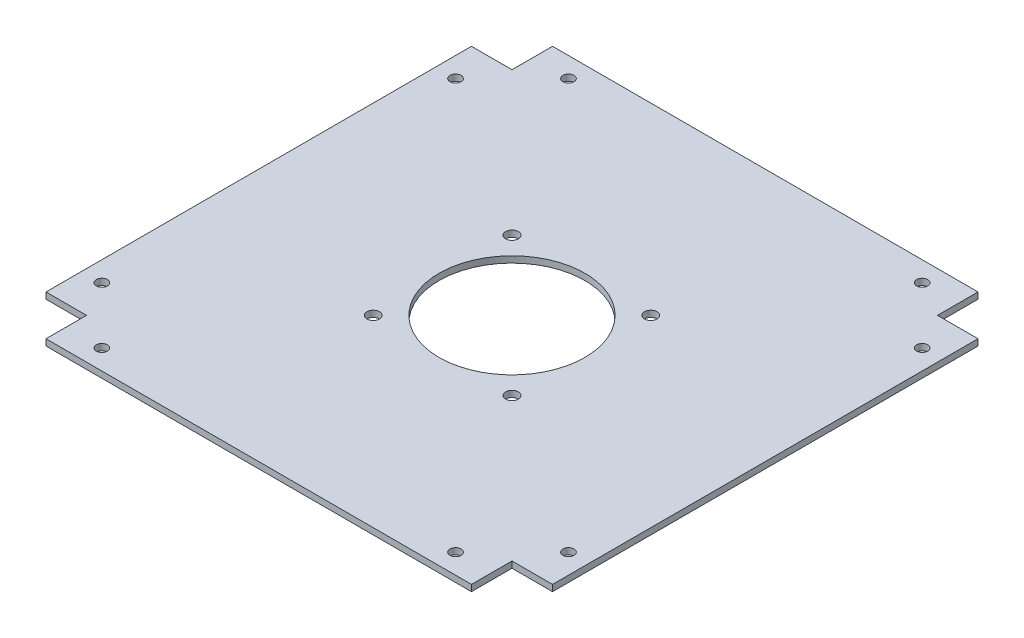
ISO-10303-21;
HEADER;
FILE_DESCRIPTION(('STEP AP214'),'2;1');
FILE_NAME('part.step','',(''),(''),'','','');
FILE_SCHEMA(('AUTOMOTIVE_DESIGN { 1 0 10303 214 1 1 1 1 }'));
ENDSEC;
DATA;
#1=APPLICATION_CONTEXT('core data for automotive mechanical design processes');
#2=APPLICATION_PROTOCOL_DEFINITION('international standard','automotive_design',2000,#1);
#3=PRODUCT_CONTEXT('',#1,'mechanical');
#4=PRODUCT('Part','Part','',(#3));
#5=PRODUCT_RELATED_PRODUCT_CATEGORY('part','',(#4));
#6=PRODUCT_DEFINITION_FORMATION('','',#4);
#7=PRODUCT_DEFINITION_CONTEXT('part definition',#1,'design');
#8=PRODUCT_DEFINITION('design','',#6,#7);
#9=PRODUCT_DEFINITION_SHAPE('','',#8);
#10=(LENGTH_UNIT() NAMED_UNIT(*) SI_UNIT(.MILLI.,.METRE.));
#11=(NAMED_UNIT(*) PLANE_ANGLE_UNIT() SI_UNIT($,.RADIAN.));
#12=(NAMED_UNIT(*) SI_UNIT($,.STERADIAN.) SOLID_ANGLE_UNIT());
#13=UNCERTAINTY_MEASURE_WITH_UNIT(LENGTH_MEASURE(1.E-05),#10,'distance_accuracy_value','');
#14=(GEOMETRIC_REPRESENTATION_CONTEXT(3) GLOBAL_UNCERTAINTY_ASSIGNED_CONTEXT((#13)) GLOBAL_UNIT_ASSIGNED_CONTEXT((#10,
#11,#12)) REPRESENTATION_CONTEXT('',''));
#15=CARTESIAN_POINT('',(0.,0.,0.));
#16=DIRECTION('',(0.,0.,1.));
#17=DIRECTION('',(1.,0.,0.));
#18=AXIS2_PLACEMENT_3D('',#15,#16,#17);
#19=CARTESIAN_POINT('',(0.,-1.5875,0.));
#20=DIRECTION('',(0.,-1.,0.));
#21=DIRECTION('',(0.,0.,-1.));
#22=AXIS2_PLACEMENT_3D('',#19,#20,#21);
#23=PLANE('',#22);
#24=DIRECTION('',(-1.,0.,0.));
#25=VECTOR('',#24,1.);
#26=CARTESIAN_POINT('',(-127.,-1.5875,127.));
#27=LINE('',#26,#25);
#28=CARTESIAN_POINT('',(106.679999999999,-1.5875,127.000000000001));
#29=VERTEX_POINT('',#28);
#30=CARTESIAN_POINT('',(-106.68,-1.5875,127.));
#31=VERTEX_POINT('',#30);
#32=EDGE_CURVE('E685',#29,#31,#27,.T.);
#33=ORIENTED_EDGE('',*,*,#32,.T.);
#34=DIRECTION('',(0.,0.,-1.));
#35=VECTOR('',#34,1.);
#36=CARTESIAN_POINT('',(-106.68,-1.5875,106.68));
#37=LINE('',#36,#35);
#38=CARTESIAN_POINT('',(-106.68,-1.5875,106.68));
#39=VERTEX_POINT('',#38);
#40=EDGE_CURVE('E698',#31,#39,#37,.T.);
#41=ORIENTED_EDGE('',*,*,#40,.T.);
#42=DIRECTION('',(-1.,0.,0.));
#43=VECTOR('',#42,1.);
#44=CARTESIAN_POINT('',(-127.,-1.5875,106.68));
#45=LINE('',#44,#43);
#46=CARTESIAN_POINT('',(-127.,-1.5875,106.68));
#47=VERTEX_POINT('',#46);
#48=EDGE_CURVE('E704',#39,#47,#45,.T.);
#49=ORIENTED_EDGE('',*,*,#48,.T.);
#50=DIRECTION('',(0.,0.,-1.));
#51=VECTOR('',#50,1.);
#52=CARTESIAN_POINT('',(-127.,-1.5875,127.));
#53=LINE('',#52,#51);
#54=CARTESIAN_POINT('',(-127.,-1.5875,-106.68));
#55=VERTEX_POINT('',#54);
#56=EDGE_CURVE('E134',#47,#55,#53,.T.);
#57=ORIENTED_EDGE('',*,*,#56,.T.);
#58=DIRECTION('',(1.,0.,0.));
#59=VECTOR('',#58,1.);
#60=CARTESIAN_POINT('',(-127.,-1.5875,-106.68));
#61=LINE('',#60,#59);
#62=CARTESIAN_POINT('',(-106.68,-1.5875,-106.68));
#63=VERTEX_POINT('',#62);
#64=EDGE_CURVE('E132',#55,#63,#61,.T.);
#65=ORIENTED_EDGE('',*,*,#64,.T.);
#66=DIRECTION('',(0.,0.,-1.));
#67=VECTOR('',#66,1.);
#68=CARTESIAN_POINT('',(-106.68,-1.5875,-106.68));
#69=LINE('',#68,#67);
#70=CARTESIAN_POINT('',(-106.68,-1.5875,-127.));
#71=VERTEX_POINT('',#70);
#72=EDGE_CURVE('E128',#63,#71,#69,.T.);
#73=ORIENTED_EDGE('',*,*,#72,.T.);
#74=DIRECTION('',(1.,0.,0.));
#75=VECTOR('',#74,1.);
#76=CARTESIAN_POINT('',(-127.,-1.5875,-127.));
#77=LINE('',#76,#75);
#78=CARTESIAN_POINT('',(106.679999999999,-1.5875,-127.));
#79=VERTEX_POINT('',#78);
#80=EDGE_CURVE('E617',#71,#79,#77,.T.);
#81=ORIENTED_EDGE('',*,*,#80,.T.);
#82=DIRECTION('',(0.,0.,1.));
#83=VECTOR('',#82,1.);
#84=CARTESIAN_POINT('',(106.679999999999,-1.5875,-106.680000000001));
#85=LINE('',#84,#83);
#86=CARTESIAN_POINT('',(106.679999999999,-1.5875,-106.680000000001));
#87=VERTEX_POINT('',#86);
#88=EDGE_CURVE('E624',#79,#87,#85,.T.);
#89=ORIENTED_EDGE('',*,*,#88,.T.);
#90=DIRECTION('',(1.,0.,0.));
#91=VECTOR('',#90,1.);
#92=CARTESIAN_POINT('',(126.999999999999,-1.5875,-106.680000000001));
#93=LINE('',#92,#91);
#94=CARTESIAN_POINT('',(126.999999999999,-1.5875,-106.680000000001));
#95=VERTEX_POINT('',#94);
#96=EDGE_CURVE('E642',#87,#95,#93,.T.);
#97=ORIENTED_EDGE('',*,*,#96,.T.);
#98=DIRECTION('',(0.,0.,1.));
#99=VECTOR('',#98,1.);
#100=CARTESIAN_POINT('',(127.,-1.5875,127.));
#101=LINE('',#100,#99);
#102=CARTESIAN_POINT('',(127.,-1.5875,106.680000000001));
#103=VERTEX_POINT('',#102);
#104=EDGE_CURVE('E646',#95,#103,#101,.T.);
#105=ORIENTED_EDGE('',*,*,#104,.T.);
#106=DIRECTION('',(-1.,0.,0.));
#107=VECTOR('',#106,1.);
#108=CARTESIAN_POINT('',(126.999999999999,-1.5875,106.680000000001));
#109=LINE('',#108,#107);
#110=CARTESIAN_POINT('',(106.679999999999,-1.5875,106.680000000001));
#111=VERTEX_POINT('',#110);
#112=EDGE_CURVE('E669',#103,#111,#109,.T.);
#113=ORIENTED_EDGE('',*,*,#112,.T.);
#114=DIRECTION('',(0.,0.,1.));
#115=VECTOR('',#114,1.);
#116=CARTESIAN_POINT('',(106.679999999999,-1.5875,106.680000000001));
#117=LINE('',#116,#115);
#118=EDGE_CURVE('E675',#111,#29,#117,.T.);
#119=ORIENTED_EDGE('',*,*,#118,.T.);
#120=EDGE_LOOP('',(#33,#41,#49,#57,#65,#73,#81,#89,#97,#105,#113,#119));
#121=FACE_BOUND('',#120,.T.);
#122=CARTESIAN_POINT('',(0.,-1.5875,0.));
#123=DIRECTION('',(0.,1.,0.));
#124=DIRECTION('',(0.,0.,1.));
#125=AXIS2_PLACEMENT_3D('',#122,#123,#124);
#126=CIRCLE('',#125,36.576);
#127=CARTESIAN_POINT('',(0.,-1.5875,36.576));
#128=VERTEX_POINT('',#127);
#129=EDGE_CURVE('E141',#128,#128,#126,.T.);
#130=ORIENTED_EDGE('',*,*,#129,.T.);
#131=EDGE_LOOP('',(#130));
#132=FACE_BOUND('',#131,.T.);
#133=CARTESIAN_POINT('',(-34.80054,-1.5875,-34.80054));
#134=DIRECTION('',(0.,1.,0.));
#135=DIRECTION('',(0.,0.,1.));
#136=AXIS2_PLACEMENT_3D('',#133,#134,#135);
#137=CIRCLE('',#136,3.175);
#138=CARTESIAN_POINT('',(-34.80054,-1.5875,-31.62554));
#139=VERTEX_POINT('',#138);
#140=EDGE_CURVE('E215',#139,#139,#137,.T.);
#141=ORIENTED_EDGE('',*,*,#140,.T.);
#142=EDGE_LOOP('',(#141));
#143=FACE_BOUND('',#142,.T.);
#144=CARTESIAN_POINT('',(34.8005399999998,-1.5875,-34.8005400000002));
#145=DIRECTION('',(0.,1.,0.));
#146=DIRECTION('',(0.,0.,1.));
#147=AXIS2_PLACEMENT_3D('',#144,#145,#146);
#148=CIRCLE('',#147,3.175);
#149=CARTESIAN_POINT('',(34.8005399999998,-1.5875,-31.6255400000002));
#150=VERTEX_POINT('',#149);
#151=EDGE_CURVE('E219',#150,#150,#148,.T.);
#152=ORIENTED_EDGE('',*,*,#151,.T.);
#153=EDGE_LOOP('',(#152));
#154=FACE_BOUND('',#153,.T.);
#155=CARTESIAN_POINT('',(34.8005399999998,-1.5875,34.8005400000002));
#156=DIRECTION('',(0.,1.,0.));
#157=DIRECTION('',(0.,0.,1.));
#158=AXIS2_PLACEMENT_3D('',#155,#156,#157);
#159=CIRCLE('',#158,3.175);
#160=CARTESIAN_POINT('',(34.8005399999998,-1.5875,37.9755400000002));
#161=VERTEX_POINT('',#160);
#162=EDGE_CURVE('E223',#161,#161,#159,.T.);
#163=ORIENTED_EDGE('',*,*,#162,.T.);
#164=EDGE_LOOP('',(#163));
#165=FACE_BOUND('',#164,.T.);
#166=CARTESIAN_POINT('',(-34.80054,-1.5875,34.80054));
#167=DIRECTION('',(0.,1.,0.));
#168=DIRECTION('',(0.,0.,1.));
#169=AXIS2_PLACEMENT_3D('',#166,#167,#168);
#170=CIRCLE('',#169,3.175);
#171=CARTESIAN_POINT('',(-34.80054,-1.5875,37.97554));
#172=VERTEX_POINT('',#171);
#173=EDGE_CURVE('E227',#172,#172,#170,.T.);
#174=ORIENTED_EDGE('',*,*,#173,.T.);
#175=EDGE_LOOP('',(#174));
#176=FACE_BOUND('',#175,.T.);
#177=CARTESIAN_POINT('',(-117.,-1.5875,-88.68));
#178=DIRECTION('',(0.,1.,0.));
#179=DIRECTION('',(0.,0.,1.));
#180=AXIS2_PLACEMENT_3D('',#177,#178,#179);
#181=CIRCLE('',#180,2.77812500000001);
#182=CARTESIAN_POINT('',(-117.,-1.5875,-85.901875));
#183=VERTEX_POINT('',#182);
#184=EDGE_CURVE('E231',#183,#183,#181,.T.);
#185=ORIENTED_EDGE('',*,*,#184,.T.);
#186=EDGE_LOOP('',(#185));
#187=FACE_BOUND('',#186,.T.);
#188=CARTESIAN_POINT('',(-117.,-1.5875,88.68));
#189=DIRECTION('',(0.,1.,0.));
#190=DIRECTION('',(0.,0.,1.));
#191=AXIS2_PLACEMENT_3D('',#188,#189,#190);
#192=CIRCLE('',#191,2.77812500000001);
#193=CARTESIAN_POINT('',(-117.,-1.5875,91.458125));
#194=VERTEX_POINT('',#193);
#195=EDGE_CURVE('E235',#194,#194,#192,.T.);
#196=ORIENTED_EDGE('',*,*,#195,.T.);
#197=EDGE_LOOP('',(#196));
#198=FACE_BOUND('',#197,.T.);
#199=CARTESIAN_POINT('',(-88.68,-1.5875,117.000000000001));
#200=DIRECTION('',(0.,1.,0.));
#201=DIRECTION('',(0.,0.,1.));
#202=AXIS2_PLACEMENT_3D('',#199,#200,#201);
#203=CIRCLE('',#202,2.77812500000001);
#204=CARTESIAN_POINT('',(-88.68,-1.5875,119.778125000001));
#205=VERTEX_POINT('',#204);
#206=EDGE_CURVE('E239',#205,#205,#203,.T.);
#207=ORIENTED_EDGE('',*,*,#206,.T.);
#208=EDGE_LOOP('',(#207));
#209=FACE_BOUND('',#208,.T.);
#210=CARTESIAN_POINT('',(88.6800000000001,-1.5875,117.000000000001));
#211=DIRECTION('',(0.,1.,0.));
#212=DIRECTION('',(0.,0.,1.));
#213=AXIS2_PLACEMENT_3D('',#210,#211,#212);
#214=CIRCLE('',#213,2.77812500000001);
#215=CARTESIAN_POINT('',(88.6800000000001,-1.5875,119.778125000001));
#216=VERTEX_POINT('',#215);
#217=EDGE_CURVE('E243',#216,#216,#214,.T.);
#218=ORIENTED_EDGE('',*,*,#217,.T.);
#219=EDGE_LOOP('',(#218));
#220=FACE_BOUND('',#219,.T.);
#221=CARTESIAN_POINT('',(-88.68,-1.5875,-117.000000000001));
#222=DIRECTION('',(0.,1.,0.));
#223=DIRECTION('',(0.,0.,1.));
#224=AXIS2_PLACEMENT_3D('',#221,#222,#223);
#225=CIRCLE('',#224,2.77812500000001);
#226=CARTESIAN_POINT('',(-88.68,-1.5875,-114.221875000001));
#227=VERTEX_POINT('',#226);
#228=EDGE_CURVE('E247',#227,#227,#225,.T.);
#229=ORIENTED_EDGE('',*,*,#228,.T.);
#230=EDGE_LOOP('',(#229));
#231=FACE_BOUND('',#230,.T.);
#232=CARTESIAN_POINT('',(117.,-1.5875,-88.68));
#233=DIRECTION('',(0.,1.,0.));
#234=DIRECTION('',(0.,0.,1.));
#235=AXIS2_PLACEMENT_3D('',#232,#233,#234);
#236=CIRCLE('',#235,2.77812500000001);
#237=CARTESIAN_POINT('',(117.,-1.5875,-85.901875));
#238=VERTEX_POINT('',#237);
#239=EDGE_CURVE('E251',#238,#238,#236,.T.);
#240=ORIENTED_EDGE('',*,*,#239,.T.);
#241=EDGE_LOOP('',(#240));
#242=FACE_BOUND('',#241,.T.);
#243=CARTESIAN_POINT('',(88.6800000000001,-1.5875,-117.000000000001));
#244=DIRECTION('',(0.,1.,0.));
#245=DIRECTION('',(0.,0.,1.));
#246=AXIS2_PLACEMENT_3D('',#243,#244,#245);
#247=CIRCLE('',#246,2.77812500000001);
#248=CARTESIAN_POINT('',(88.6800000000001,-1.5875,-114.221875000001));
#249=VERTEX_POINT('',#248);
#250=EDGE_CURVE('E254',#249,#249,#247,.T.);
#251=ORIENTED_EDGE('',*,*,#250,.T.);
#252=EDGE_LOOP('',(#251));
#253=FACE_BOUND('',#252,.T.);
#254=CARTESIAN_POINT('',(117.,-1.5875,88.68));
#255=DIRECTION('',(0.,1.,0.));
#256=DIRECTION('',(0.,0.,1.));
#257=AXIS2_PLACEMENT_3D('',#254,#255,#256);
#258=CIRCLE('',#257,2.77812500000001);
#259=CARTESIAN_POINT('',(117.,-1.5875,91.458125));
#260=VERTEX_POINT('',#259);
#261=EDGE_CURVE('E20',#260,#260,#258,.T.);
#262=ORIENTED_EDGE('',*,*,#261,.T.);
#263=EDGE_LOOP('',(#262));
#264=FACE_BOUND('',#263,.T.);
#265=ADVANCED_FACE('F17',(#121,#132,#143,#154,#165,#176,#187,#198,#209,#220,#231,#242,#253,
#264),#23,.T.);
#266=CARTESIAN_POINT('',(117.,-1.5875,88.68));
#267=DIRECTION('',(0.,1.,0.));
#268=DIRECTION('',(0.,0.,1.));
#269=AXIS2_PLACEMENT_3D('',#266,#267,#268);
#270=CYLINDRICAL_SURFACE('',#269,2.77812500000001);
#271=ORIENTED_EDGE('',*,*,#261,.F.);
#272=EDGE_LOOP('',(#271));
#273=FACE_BOUND('',#272,.T.);
#274=CARTESIAN_POINT('',(117.,1.5875,88.68));
#275=DIRECTION('',(0.,1.,0.));
#276=DIRECTION('',(0.,0.,1.));
#277=AXIS2_PLACEMENT_3D('',#274,#275,#276);
#278=CIRCLE('',#277,2.77812500000001);
#279=CARTESIAN_POINT('',(117.,1.5875,91.458125));
#280=VERTEX_POINT('',#279);
#281=EDGE_CURVE('E208',#280,#280,#278,.T.);
#282=ORIENTED_EDGE('',*,*,#281,.T.);
#283=EDGE_LOOP('',(#282));
#284=FACE_BOUND('',#283,.T.);
#285=ADVANCED_FACE('F266',(#273,#284),#270,.F.);
#286=CARTESIAN_POINT('',(88.6800000000001,-1.5875,-117.000000000001));
#287=DIRECTION('',(0.,1.,0.));
#288=DIRECTION('',(0.,0.,1.));
#289=AXIS2_PLACEMENT_3D('',#286,#287,#288);
#290=CYLINDRICAL_SURFACE('',#289,2.77812500000001);
#291=ORIENTED_EDGE('',*,*,#250,.F.);
#292=EDGE_LOOP('',(#291));
#293=FACE_BOUND('',#292,.T.);
#294=CARTESIAN_POINT('',(88.6800000000001,1.5875,-117.000000000001));
#295=DIRECTION('',(0.,1.,0.));
#296=DIRECTION('',(0.,0.,1.));
#297=AXIS2_PLACEMENT_3D('',#294,#295,#296);
#298=CIRCLE('',#297,2.77812500000001);
#299=CARTESIAN_POINT('',(88.6800000000001,1.5875,-114.221875000001));
#300=VERTEX_POINT('',#299);
#301=EDGE_CURVE('E204',#300,#300,#298,.T.);
#302=ORIENTED_EDGE('',*,*,#301,.T.);
#303=EDGE_LOOP('',(#302));
#304=FACE_BOUND('',#303,.T.);
#305=ADVANCED_FACE('F269',(#293,#304),#290,.F.);
#306=CARTESIAN_POINT('',(117.,-1.5875,-88.68));
#307=DIRECTION('',(0.,1.,0.));
#308=DIRECTION('',(0.,0.,1.));
#309=AXIS2_PLACEMENT_3D('',#306,#307,#308);
#310=CYLINDRICAL_SURFACE('',#309,2.77812500000001);
#311=ORIENTED_EDGE('',*,*,#239,.F.);
#312=EDGE_LOOP('',(#311));
#313=FACE_BOUND('',#312,.T.);
#314=CARTESIAN_POINT('',(117.,1.5875,-88.68));
#315=DIRECTION('',(0.,1.,0.));
#316=DIRECTION('',(0.,0.,1.));
#317=AXIS2_PLACEMENT_3D('',#314,#315,#316);
#318=CIRCLE('',#317,2.77812500000001);
#319=CARTESIAN_POINT('',(117.,1.5875,-85.901875));
#320=VERTEX_POINT('',#319);
#321=EDGE_CURVE('E201',#320,#320,#318,.T.);
#322=ORIENTED_EDGE('',*,*,#321,.T.);
#323=EDGE_LOOP('',(#322));
#324=FACE_BOUND('',#323,.T.);
#325=ADVANCED_FACE('F364',(#313,#324),#310,.F.);
#326=CARTESIAN_POINT('',(-88.68,-1.5875,-117.000000000001));
#327=DIRECTION('',(0.,1.,0.));
#328=DIRECTION('',(0.,0.,1.));
#329=AXIS2_PLACEMENT_3D('',#326,#327,#328);
#330=CYLINDRICAL_SURFACE('',#329,2.77812500000001);
#331=ORIENTED_EDGE('',*,*,#228,.F.);
#332=EDGE_LOOP('',(#331));
#333=FACE_BOUND('',#332,.T.);
#334=CARTESIAN_POINT('',(-88.68,1.5875,-117.000000000001));
#335=DIRECTION('',(0.,1.,0.));
#336=DIRECTION('',(0.,0.,1.));
#337=AXIS2_PLACEMENT_3D('',#334,#335,#336);
#338=CIRCLE('',#337,2.77812500000001);
#339=CARTESIAN_POINT('',(-88.68,1.5875,-114.221875000001));
#340=VERTEX_POINT('',#339);
#341=EDGE_CURVE('E197',#340,#340,#338,.T.);
#342=ORIENTED_EDGE('',*,*,#341,.T.);
#343=EDGE_LOOP('',(#342));
#344=FACE_BOUND('',#343,.T.);
#345=ADVANCED_FACE('F360',(#333,#344),#330,.F.);
#346=CARTESIAN_POINT('',(88.6800000000001,-1.5875,117.000000000001));
#347=DIRECTION('',(0.,1.,0.));
#348=DIRECTION('',(0.,0.,1.));
#349=AXIS2_PLACEMENT_3D('',#346,#347,#348);
#350=CYLINDRICAL_SURFACE('',#349,2.77812500000001);
#351=ORIENTED_EDGE('',*,*,#217,.F.);
#352=EDGE_LOOP('',(#351));
#353=FACE_BOUND('',#352,.T.);
#354=CARTESIAN_POINT('',(88.6800000000001,1.5875,117.000000000001));
#355=DIRECTION('',(0.,1.,0.));
#356=DIRECTION('',(0.,0.,1.));
#357=AXIS2_PLACEMENT_3D('',#354,#355,#356);
#358=CIRCLE('',#357,2.77812500000001);
#359=CARTESIAN_POINT('',(88.6800000000001,1.5875,119.778125000001));
#360=VERTEX_POINT('',#359);
#361=EDGE_CURVE('E193',#360,#360,#358,.T.);
#362=ORIENTED_EDGE('',*,*,#361,.T.);
#363=EDGE_LOOP('',(#362));
#364=FACE_BOUND('',#363,.T.);
#365=ADVANCED_FACE('F356',(#353,#364),#350,.F.);
#366=CARTESIAN_POINT('',(-88.68,-1.5875,117.000000000001));
#367=DIRECTION('',(0.,1.,0.));
#368=DIRECTION('',(0.,0.,1.));
#369=AXIS2_PLACEMENT_3D('',#366,#367,#368);
#370=CYLINDRICAL_SURFACE('',#369,2.77812500000001);
#371=ORIENTED_EDGE('',*,*,#206,.F.);
#372=EDGE_LOOP('',(#371));
#373=FACE_BOUND('',#372,.T.);
#374=CARTESIAN_POINT('',(-88.68,1.5875,117.000000000001));
#375=DIRECTION('',(0.,1.,0.));
#376=DIRECTION('',(0.,0.,1.));
#377=AXIS2_PLACEMENT_3D('',#374,#375,#376);
#378=CIRCLE('',#377,2.77812500000001);
#379=CARTESIAN_POINT('',(-88.68,1.5875,119.778125000001));
#380=VERTEX_POINT('',#379);
#381=EDGE_CURVE('E189',#380,#380,#378,.T.);
#382=ORIENTED_EDGE('',*,*,#381,.T.);
#383=EDGE_LOOP('',(#382));
#384=FACE_BOUND('',#383,.T.);
#385=ADVANCED_FACE('F352',(#373,#384),#370,.F.);
#386=CARTESIAN_POINT('',(-117.,-1.5875,88.68));
#387=DIRECTION('',(0.,1.,0.));
#388=DIRECTION('',(0.,0.,1.));
#389=AXIS2_PLACEMENT_3D('',#386,#387,#388);
#390=CYLINDRICAL_SURFACE('',#389,2.77812500000001);
#391=ORIENTED_EDGE('',*,*,#195,.F.);
#392=EDGE_LOOP('',(#391));
#393=FACE_BOUND('',#392,.T.);
#394=CARTESIAN_POINT('',(-117.,1.5875,88.68));
#395=DIRECTION('',(0.,1.,0.));
#396=DIRECTION('',(0.,0.,1.));
#397=AXIS2_PLACEMENT_3D('',#394,#395,#396);
#398=CIRCLE('',#397,2.77812500000001);
#399=CARTESIAN_POINT('',(-117.,1.5875,91.458125));
#400=VERTEX_POINT('',#399);
#401=EDGE_CURVE('E185',#400,#400,#398,.T.);
#402=ORIENTED_EDGE('',*,*,#401,.T.);
#403=EDGE_LOOP('',(#402));
#404=FACE_BOUND('',#403,.T.);
#405=ADVANCED_FACE('F348',(#393,#404),#390,.F.);
#406=CARTESIAN_POINT('',(-117.,-1.5875,-88.68));
#407=DIRECTION('',(0.,1.,0.));
#408=DIRECTION('',(0.,0.,1.));
#409=AXIS2_PLACEMENT_3D('',#406,#407,#408);
#410=CYLINDRICAL_SURFACE('',#409,2.77812500000001);
#411=ORIENTED_EDGE('',*,*,#184,.F.);
#412=EDGE_LOOP('',(#411));
#413=FACE_BOUND('',#412,.T.);
#414=CARTESIAN_POINT('',(-117.,1.5875,-88.68));
#415=DIRECTION('',(0.,1.,0.));
#416=DIRECTION('',(0.,0.,1.));
#417=AXIS2_PLACEMENT_3D('',#414,#415,#416);
#418=CIRCLE('',#417,2.77812500000001);
#419=CARTESIAN_POINT('',(-117.,1.5875,-85.901875));
#420=VERTEX_POINT('',#419);
#421=EDGE_CURVE('E181',#420,#420,#418,.T.);
#422=ORIENTED_EDGE('',*,*,#421,.T.);
#423=EDGE_LOOP('',(#422));
#424=FACE_BOUND('',#423,.T.);
#425=ADVANCED_FACE('F344',(#413,#424),#410,.F.);
#426=CARTESIAN_POINT('',(-34.80054,-1.5875,34.80054));
#427=DIRECTION('',(0.,1.,0.));
#428=DIRECTION('',(0.,0.,1.));
#429=AXIS2_PLACEMENT_3D('',#426,#427,#428);
#430=CYLINDRICAL_SURFACE('',#429,3.175);
#431=ORIENTED_EDGE('',*,*,#173,.F.);
#432=EDGE_LOOP('',(#431));
#433=FACE_BOUND('',#432,.T.);
#434=CARTESIAN_POINT('',(-34.80054,1.5875,34.80054));
#435=DIRECTION('',(0.,1.,0.));
#436=DIRECTION('',(0.,0.,1.));
#437=AXIS2_PLACEMENT_3D('',#434,#435,#436);
#438=CIRCLE('',#437,3.175);
#439=CARTESIAN_POINT('',(-34.80054,1.5875,37.97554));
#440=VERTEX_POINT('',#439);
#441=EDGE_CURVE('E177',#440,#440,#438,.T.);
#442=ORIENTED_EDGE('',*,*,#441,.T.);
#443=EDGE_LOOP('',(#442));
#444=FACE_BOUND('',#443,.T.);
#445=ADVANCED_FACE('F340',(#433,#444),#430,.F.);
#446=CARTESIAN_POINT('',(34.8005399999998,-1.5875,34.8005400000002));
#447=DIRECTION('',(0.,1.,0.));
#448=DIRECTION('',(0.,0.,1.));
#449=AXIS2_PLACEMENT_3D('',#446,#447,#448);
#450=CYLINDRICAL_SURFACE('',#449,3.175);
#451=ORIENTED_EDGE('',*,*,#162,.F.);
#452=EDGE_LOOP('',(#451));
#453=FACE_BOUND('',#452,.T.);
#454=CARTESIAN_POINT('',(34.8005399999998,1.5875,34.8005400000002));
#455=DIRECTION('',(0.,1.,0.));
#456=DIRECTION('',(0.,0.,1.));
#457=AXIS2_PLACEMENT_3D('',#454,#455,#456);
#458=CIRCLE('',#457,3.175);
#459=CARTESIAN_POINT('',(34.8005399999998,1.5875,37.9755400000002));
#460=VERTEX_POINT('',#459);
#461=EDGE_CURVE('E173',#460,#460,#458,.T.);
#462=ORIENTED_EDGE('',*,*,#461,.T.);
#463=EDGE_LOOP('',(#462));
#464=FACE_BOUND('',#463,.T.);
#465=ADVANCED_FACE('F336',(#453,#464),#450,.F.);
#466=CARTESIAN_POINT('',(34.8005399999998,-1.5875,-34.8005400000002));
#467=DIRECTION('',(0.,1.,0.));
#468=DIRECTION('',(0.,0.,1.));
#469=AXIS2_PLACEMENT_3D('',#466,#467,#468);
#470=CYLINDRICAL_SURFACE('',#469,3.175);
#471=ORIENTED_EDGE('',*,*,#151,.F.);
#472=EDGE_LOOP('',(#471));
#473=FACE_BOUND('',#472,.T.);
#474=CARTESIAN_POINT('',(34.8005399999998,1.5875,-34.8005400000002));
#475=DIRECTION('',(0.,1.,0.));
#476=DIRECTION('',(0.,0.,1.));
#477=AXIS2_PLACEMENT_3D('',#474,#475,#476);
#478=CIRCLE('',#477,3.175);
#479=CARTESIAN_POINT('',(34.8005399999998,1.5875,-31.6255400000002));
#480=VERTEX_POINT('',#479);
#481=EDGE_CURVE('E169',#480,#480,#478,.T.);
#482=ORIENTED_EDGE('',*,*,#481,.T.);
#483=EDGE_LOOP('',(#482));
#484=FACE_BOUND('',#483,.T.);
#485=ADVANCED_FACE('F332',(#473,#484),#470,.F.);
#486=CARTESIAN_POINT('',(-34.80054,-1.5875,-34.80054));
#487=DIRECTION('',(0.,1.,0.));
#488=DIRECTION('',(0.,0.,1.));
#489=AXIS2_PLACEMENT_3D('',#486,#487,#488);
#490=CYLINDRICAL_SURFACE('',#489,3.175);
#491=ORIENTED_EDGE('',*,*,#140,.F.);
#492=EDGE_LOOP('',(#491));
#493=FACE_BOUND('',#492,.T.);
#494=CARTESIAN_POINT('',(-34.80054,1.5875,-34.80054));
#495=DIRECTION('',(0.,1.,0.));
#496=DIRECTION('',(0.,0.,1.));
#497=AXIS2_PLACEMENT_3D('',#494,#495,#496);
#498=CIRCLE('',#497,3.175);
#499=CARTESIAN_POINT('',(-34.80054,1.5875,-31.62554));
#500=VERTEX_POINT('',#499);
#501=EDGE_CURVE('E165',#500,#500,#498,.T.);
#502=ORIENTED_EDGE('',*,*,#501,.T.);
#503=EDGE_LOOP('',(#502));
#504=FACE_BOUND('',#503,.T.);
#505=ADVANCED_FACE('F328',(#493,#504),#490,.F.);
#506=CARTESIAN_POINT('',(0.,-1.5875,0.));
#507=DIRECTION('',(0.,1.,0.));
#508=DIRECTION('',(0.,0.,1.));
#509=AXIS2_PLACEMENT_3D('',#506,#507,#508);
#510=CYLINDRICAL_SURFACE('',#509,36.576);
#511=ORIENTED_EDGE('',*,*,#129,.F.);
#512=EDGE_LOOP('',(#511));
#513=FACE_BOUND('',#512,.T.);
#514=CARTESIAN_POINT('',(0.,1.5875,0.));
#515=DIRECTION('',(0.,1.,0.));
#516=DIRECTION('',(0.,0.,1.));
#517=AXIS2_PLACEMENT_3D('',#514,#515,#516);
#518=CIRCLE('',#517,36.576);
#519=CARTESIAN_POINT('',(0.,1.5875,36.576));
#520=VERTEX_POINT('',#519);
#521=EDGE_CURVE('E161',#520,#520,#518,.T.);
#522=ORIENTED_EDGE('',*,*,#521,.T.);
#523=EDGE_LOOP('',(#522));
#524=FACE_BOUND('',#523,.T.);
#525=ADVANCED_FACE('F325',(#513,#524),#510,.F.);
#526=CARTESIAN_POINT('',(-127.,-1.5875,-106.68));
#527=DIRECTION('',(0.,0.,1.));
#528=DIRECTION('',(1.,0.,0.));
#529=AXIS2_PLACEMENT_3D('',#526,#527,#528);
#530=PLANE('',#529);
#531=DIRECTION('',(0.,1.,0.));
#532=VECTOR('',#531,1.);
#533=CARTESIAN_POINT('',(-106.68,-1.5875,-106.68));
#534=LINE('',#533,#532);
#535=CARTESIAN_POINT('',(-106.68,1.5875,-106.68));
#536=VERTEX_POINT('',#535);
#537=EDGE_CURVE('E140',#536,#63,#534,.F.);
#538=ORIENTED_EDGE('',*,*,#537,.T.);
#539=ORIENTED_EDGE('',*,*,#64,.F.);
#540=DIRECTION('',(0.,1.,0.));
#541=VECTOR('',#540,1.);
#542=CARTESIAN_POINT('',(-127.,1.5875,-106.68));
#543=LINE('',#542,#541);
#544=CARTESIAN_POINT('',(-127.,1.5875,-106.68));
#545=VERTEX_POINT('',#544);
#546=EDGE_CURVE('E707',#55,#545,#543,.T.);
#547=ORIENTED_EDGE('',*,*,#546,.T.);
#548=DIRECTION('',(1.,0.,0.));
#549=VECTOR('',#548,1.);
#550=CARTESIAN_POINT('',(0.,1.5875,-106.68));
#551=LINE('',#550,#549);
#552=EDGE_CURVE('E153',#545,#536,#551,.T.);
#553=ORIENTED_EDGE('',*,*,#552,.T.);
#554=EDGE_LOOP('',(#538,#539,#547,#553));
#555=FACE_BOUND('',#554,.T.);
#556=ADVANCED_FACE('F152',(#555),#530,.F.);
#557=CARTESIAN_POINT('',(-106.68,-1.5875,-106.68));
#558=DIRECTION('',(1.,0.,0.));
#559=DIRECTION('',(0.,0.,-1.));
#560=AXIS2_PLACEMENT_3D('',#557,#558,#559);
#561=PLANE('',#560);
#562=DIRECTION('',(0.,1.,0.));
#563=VECTOR('',#562,1.);
#564=CARTESIAN_POINT('',(-106.68,1.5875,-127.));
#565=LINE('',#564,#563);
#566=CARTESIAN_POINT('',(-106.68,1.5875,-127.));
#567=VERTEX_POINT('',#566);
#568=EDGE_CURVE('E148',#567,#71,#565,.F.);
#569=ORIENTED_EDGE('',*,*,#568,.T.);
#570=ORIENTED_EDGE('',*,*,#72,.F.);
#571=ORIENTED_EDGE('',*,*,#537,.F.);
#572=DIRECTION('',(0.,0.,-1.));
#573=VECTOR('',#572,1.);
#574=CARTESIAN_POINT('',(-106.68,1.5875,0.));
#575=LINE('',#574,#573);
#576=EDGE_CURVE('E637',#536,#567,#575,.T.);
#577=ORIENTED_EDGE('',*,*,#576,.T.);
#578=EDGE_LOOP('',(#569,#570,#571,#577));
#579=FACE_BOUND('',#578,.T.);
#580=ADVANCED_FACE('F145',(#579),#561,.F.);
#581=CARTESIAN_POINT('',(-127.,1.5875,-127.));
#582=DIRECTION('',(0.,0.,1.));
#583=DIRECTION('',(1.,0.,0.));
#584=AXIS2_PLACEMENT_3D('',#581,#582,#583);
#585=PLANE('',#584);
#586=DIRECTION('',(0.,1.,0.));
#587=VECTOR('',#586,1.);
#588=CARTESIAN_POINT('',(106.679999999999,-1.5875,-127.000000000001));
#589=LINE('',#588,#587);
#590=CARTESIAN_POINT('',(106.679999999999,1.5875,-127.));
#591=VERTEX_POINT('',#590);
#592=EDGE_CURVE('E616',#591,#79,#589,.F.);
#593=ORIENTED_EDGE('',*,*,#592,.T.);
#594=ORIENTED_EDGE('',*,*,#80,.F.);
#595=ORIENTED_EDGE('',*,*,#568,.F.);
#596=DIRECTION('',(1.,0.,0.));
#597=VECTOR('',#596,1.);
#598=CARTESIAN_POINT('',(0.,1.5875,-127.));
#599=LINE('',#598,#597);
#600=EDGE_CURVE('E619',#567,#591,#599,.T.);
#601=ORIENTED_EDGE('',*,*,#600,.T.);
#602=EDGE_LOOP('',(#593,#594,#595,#601));
#603=FACE_BOUND('',#602,.T.);
#604=ADVANCED_FACE('F316',(#603),#585,.F.);
#605=CARTESIAN_POINT('',(106.679999999999,-1.5875,-106.680000000001));
#606=DIRECTION('',(-1.,0.,0.));
#607=DIRECTION('',(0.,0.,1.));
#608=AXIS2_PLACEMENT_3D('',#605,#606,#607);
#609=PLANE('',#608);
#610=DIRECTION('',(0.,1.,0.));
#611=VECTOR('',#610,1.);
#612=CARTESIAN_POINT('',(106.679999999999,-1.5875,-106.680000000001));
#613=LINE('',#612,#611);
#614=CARTESIAN_POINT('',(106.679999999999,1.5875,-106.680000000001));
#615=VERTEX_POINT('',#614);
#616=EDGE_CURVE('E628',#615,#87,#613,.F.);
#617=ORIENTED_EDGE('',*,*,#616,.T.);
#618=ORIENTED_EDGE('',*,*,#88,.F.);
#619=ORIENTED_EDGE('',*,*,#592,.F.);
#620=DIRECTION('',(0.,0.,-1.));
#621=VECTOR('',#620,1.);
#622=CARTESIAN_POINT('',(106.679999999999,1.5875,0.));
#623=LINE('',#622,#621);
#624=EDGE_CURVE('E661',#591,#615,#623,.F.);
#625=ORIENTED_EDGE('',*,*,#624,.T.);
#626=EDGE_LOOP('',(#617,#618,#619,#625));
#627=FACE_BOUND('',#626,.T.);
#628=ADVANCED_FACE('F312',(#627),#609,.F.);
#629=CARTESIAN_POINT('',(126.999999999999,-1.5875,-106.680000000001));
#630=DIRECTION('',(0.,0.,1.));
#631=DIRECTION('',(1.,0.,0.));
#632=AXIS2_PLACEMENT_3D('',#629,#630,#631);
#633=PLANE('',#632);
#634=DIRECTION('',(0.,1.,0.));
#635=VECTOR('',#634,1.);
#636=CARTESIAN_POINT('',(127.,1.5875,-106.680000000001));
#637=LINE('',#636,#635);
#638=CARTESIAN_POINT('',(126.999999999999,1.5875,-106.680000000001));
#639=VERTEX_POINT('',#638);
#640=EDGE_CURVE('E644',#639,#95,#637,.F.);
#641=ORIENTED_EDGE('',*,*,#640,.T.);
#642=ORIENTED_EDGE('',*,*,#96,.F.);
#643=ORIENTED_EDGE('',*,*,#616,.F.);
#644=DIRECTION('',(1.,0.,0.));
#645=VECTOR('',#644,1.);
#646=CARTESIAN_POINT('',(0.,1.5875,-106.680000000001));
#647=LINE('',#646,#645);
#648=EDGE_CURVE('E654',#615,#639,#647,.T.);
#649=ORIENTED_EDGE('',*,*,#648,.T.);
#650=EDGE_LOOP('',(#641,#642,#643,#649));
#651=FACE_BOUND('',#650,.T.);
#652=ADVANCED_FACE('F308',(#651),#633,.F.);
#653=CARTESIAN_POINT('',(127.,1.5875,127.));
#654=DIRECTION('',(-1.,0.,0.));
#655=DIRECTION('',(0.,0.,1.));
#656=AXIS2_PLACEMENT_3D('',#653,#654,#655);
#657=PLANE('',#656);
#658=DIRECTION('',(0.,1.,0.));
#659=VECTOR('',#658,1.);
#660=CARTESIAN_POINT('',(126.999999999999,-1.5875,106.680000000001));
#661=LINE('',#660,#659);
#662=CARTESIAN_POINT('',(127.,1.5875,106.680000000001));
#663=VERTEX_POINT('',#662);
#664=EDGE_CURVE('E648',#663,#103,#661,.F.);
#665=ORIENTED_EDGE('',*,*,#664,.T.);
#666=ORIENTED_EDGE('',*,*,#104,.F.);
#667=ORIENTED_EDGE('',*,*,#640,.F.);
#668=DIRECTION('',(0.,0.,-1.));
#669=VECTOR('',#668,1.);
#670=CARTESIAN_POINT('',(126.999999999999,1.5875,0.));
#671=LINE('',#670,#669);
#672=EDGE_CURVE('E650',#639,#663,#671,.F.);
#673=ORIENTED_EDGE('',*,*,#672,.T.);
#674=EDGE_LOOP('',(#665,#666,#667,#673));
#675=FACE_BOUND('',#674,.T.);
#676=ADVANCED_FACE('F304',(#675),#657,.F.);
#677=CARTESIAN_POINT('',(126.999999999999,-1.5875,106.680000000001));
#678=DIRECTION('',(0.,0.,-1.));
#679=DIRECTION('',(-1.,0.,0.));
#680=AXIS2_PLACEMENT_3D('',#677,#678,#679);
#681=PLANE('',#680);
#682=DIRECTION('',(0.,1.,0.));
#683=VECTOR('',#682,1.);
#684=CARTESIAN_POINT('',(106.679999999999,-1.5875,106.680000000001));
#685=LINE('',#684,#683);
#686=CARTESIAN_POINT('',(106.679999999999,1.5875,106.680000000001));
#687=VERTEX_POINT('',#686);
#688=EDGE_CURVE('E671',#687,#111,#685,.F.);
#689=ORIENTED_EDGE('',*,*,#688,.T.);
#690=ORIENTED_EDGE('',*,*,#112,.F.);
#691=ORIENTED_EDGE('',*,*,#664,.F.);
#692=DIRECTION('',(1.,0.,0.));
#693=VECTOR('',#692,1.);
#694=CARTESIAN_POINT('',(0.,1.5875,106.680000000001));
#695=LINE('',#694,#693);
#696=EDGE_CURVE('E653',#663,#687,#695,.F.);
#697=ORIENTED_EDGE('',*,*,#696,.T.);
#698=EDGE_LOOP('',(#689,#690,#691,#697));
#699=FACE_BOUND('',#698,.T.);
#700=ADVANCED_FACE('F300',(#699),#681,.F.);
#701=CARTESIAN_POINT('',(106.679999999999,-1.5875,106.680000000001));
#702=DIRECTION('',(-1.,0.,0.));
#703=DIRECTION('',(0.,0.,1.));
#704=AXIS2_PLACEMENT_3D('',#701,#702,#703);
#705=PLANE('',#704);
#706=DIRECTION('',(0.,1.,0.));
#707=VECTOR('',#706,1.);
#708=CARTESIAN_POINT('',(106.679999999999,1.5875,127.));
#709=LINE('',#708,#707);
#710=CARTESIAN_POINT('',(106.679999999999,1.5875,127.000000000001));
#711=VERTEX_POINT('',#710);
#712=EDGE_CURVE('E682',#711,#29,#709,.F.);
#713=ORIENTED_EDGE('',*,*,#712,.T.);
#714=ORIENTED_EDGE('',*,*,#118,.F.);
#715=ORIENTED_EDGE('',*,*,#688,.F.);
#716=DIRECTION('',(0.,0.,-1.));
#717=VECTOR('',#716,1.);
#718=CARTESIAN_POINT('',(106.679999999999,1.5875,0.));
#719=LINE('',#718,#717);
#720=EDGE_CURVE('E667',#687,#711,#719,.F.);
#721=ORIENTED_EDGE('',*,*,#720,.T.);
#722=EDGE_LOOP('',(#713,#714,#715,#721));
#723=FACE_BOUND('',#722,.T.);
#724=ADVANCED_FACE('F296',(#723),#705,.F.);
#725=CARTESIAN_POINT('',(-127.,1.5875,127.));
#726=DIRECTION('',(0.,0.,-1.));
#727=DIRECTION('',(-1.,0.,0.));
#728=AXIS2_PLACEMENT_3D('',#725,#726,#727);
#729=PLANE('',#728);
#730=DIRECTION('',(0.,1.,0.));
#731=VECTOR('',#730,1.);
#732=CARTESIAN_POINT('',(-106.68,-1.5875,127.));
#733=LINE('',#732,#731);
#734=CARTESIAN_POINT('',(-106.68,1.5875,127.));
#735=VERTEX_POINT('',#734);
#736=EDGE_CURVE('E694',#735,#31,#733,.F.);
#737=ORIENTED_EDGE('',*,*,#736,.T.);
#738=ORIENTED_EDGE('',*,*,#32,.F.);
#739=ORIENTED_EDGE('',*,*,#712,.F.);
#740=DIRECTION('',(1.,0.,0.));
#741=VECTOR('',#740,1.);
#742=CARTESIAN_POINT('',(0.,1.5875,127.000000000001));
#743=LINE('',#742,#741);
#744=EDGE_CURVE('E679',#711,#735,#743,.F.);
#745=ORIENTED_EDGE('',*,*,#744,.T.);
#746=EDGE_LOOP('',(#737,#738,#739,#745));
#747=FACE_BOUND('',#746,.T.);
#748=ADVANCED_FACE('F292',(#747),#729,.F.);
#749=CARTESIAN_POINT('',(-106.68,-1.5875,106.68));
#750=DIRECTION('',(1.,0.,0.));
#751=DIRECTION('',(0.,0.,-1.));
#752=AXIS2_PLACEMENT_3D('',#749,#750,#751);
#753=PLANE('',#752);
#754=DIRECTION('',(0.,1.,0.));
#755=VECTOR('',#754,1.);
#756=CARTESIAN_POINT('',(-106.68,-1.5875,106.68));
#757=LINE('',#756,#755);
#758=CARTESIAN_POINT('',(-106.68,1.5875,106.68));
#759=VERTEX_POINT('',#758);
#760=EDGE_CURVE('E701',#759,#39,#757,.F.);
#761=ORIENTED_EDGE('',*,*,#760,.T.);
#762=ORIENTED_EDGE('',*,*,#40,.F.);
#763=ORIENTED_EDGE('',*,*,#736,.F.);
#764=DIRECTION('',(0.,0.,-1.));
#765=VECTOR('',#764,1.);
#766=CARTESIAN_POINT('',(-106.68,1.5875,0.));
#767=LINE('',#766,#765);
#768=EDGE_CURVE('E718',#735,#759,#767,.T.);
#769=ORIENTED_EDGE('',*,*,#768,.T.);
#770=EDGE_LOOP('',(#761,#762,#763,#769));
#771=FACE_BOUND('',#770,.T.);
#772=ADVANCED_FACE('F288',(#771),#753,.F.);
#773=CARTESIAN_POINT('',(-127.,-1.5875,106.68));
#774=DIRECTION('',(0.,0.,-1.));
#775=DIRECTION('',(-1.,0.,0.));
#776=AXIS2_PLACEMENT_3D('',#773,#774,#775);
#777=PLANE('',#776);
#778=DIRECTION('',(0.,1.,0.));
#779=VECTOR('',#778,1.);
#780=CARTESIAN_POINT('',(-127.,1.5875,106.68));
#781=LINE('',#780,#779);
#782=CARTESIAN_POINT('',(-127.,1.5875,106.68));
#783=VERTEX_POINT('',#782);
#784=EDGE_CURVE('E39',#783,#47,#781,.F.);
#785=ORIENTED_EDGE('',*,*,#784,.T.);
#786=ORIENTED_EDGE('',*,*,#48,.F.);
#787=ORIENTED_EDGE('',*,*,#760,.F.);
#788=DIRECTION('',(1.,0.,0.));
#789=VECTOR('',#788,1.);
#790=CARTESIAN_POINT('',(0.,1.5875,106.68));
#791=LINE('',#790,#789);
#792=EDGE_CURVE('E27',#759,#783,#791,.F.);
#793=ORIENTED_EDGE('',*,*,#792,.T.);
#794=EDGE_LOOP('',(#785,#786,#787,#793));
#795=FACE_BOUND('',#794,.T.);
#796=ADVANCED_FACE('F281',(#795),#777,.F.);
#797=CARTESIAN_POINT('',(-127.,1.5875,127.));
#798=DIRECTION('',(1.,0.,0.));
#799=DIRECTION('',(0.,0.,-1.));
#800=AXIS2_PLACEMENT_3D('',#797,#798,#799);
#801=PLANE('',#800);
#802=ORIENTED_EDGE('',*,*,#784,.F.);
#803=DIRECTION('',(0.,0.,-1.));
#804=VECTOR('',#803,1.);
#805=CARTESIAN_POINT('',(-127.,1.5875,0.));
#806=LINE('',#805,#804);
#807=EDGE_CURVE('E11',#783,#545,#806,.T.);
#808=ORIENTED_EDGE('',*,*,#807,.T.);
#809=ORIENTED_EDGE('',*,*,#546,.F.);
#810=ORIENTED_EDGE('',*,*,#56,.F.);
#811=EDGE_LOOP('',(#802,#808,#809,#810));
#812=FACE_BOUND('',#811,.T.);
#813=ADVANCED_FACE('F274',(#812),#801,.F.);
#814=CARTESIAN_POINT('',(0.,1.5875,0.));
#815=DIRECTION('',(0.,-1.,0.));
#816=DIRECTION('',(0.,0.,-1.));
#817=AXIS2_PLACEMENT_3D('',#814,#815,#816);
#818=PLANE('',#817);
#819=ORIENTED_EDGE('',*,*,#792,.F.);
#820=ORIENTED_EDGE('',*,*,#768,.F.);
#821=ORIENTED_EDGE('',*,*,#744,.F.);
#822=ORIENTED_EDGE('',*,*,#720,.F.);
#823=ORIENTED_EDGE('',*,*,#696,.F.);
#824=ORIENTED_EDGE('',*,*,#672,.F.);
#825=ORIENTED_EDGE('',*,*,#648,.F.);
#826=ORIENTED_EDGE('',*,*,#624,.F.);
#827=ORIENTED_EDGE('',*,*,#600,.F.);
#828=ORIENTED_EDGE('',*,*,#576,.F.);
#829=ORIENTED_EDGE('',*,*,#552,.F.);
#830=ORIENTED_EDGE('',*,*,#807,.F.);
#831=EDGE_LOOP('',(#819,#820,#821,#822,#823,#824,#825,#826,#827,#828,#829,#830));
#832=FACE_BOUND('',#831,.T.);
#833=ORIENTED_EDGE('',*,*,#521,.F.);
#834=EDGE_LOOP('',(#833));
#835=FACE_BOUND('',#834,.T.);
#836=ORIENTED_EDGE('',*,*,#501,.F.);
#837=EDGE_LOOP('',(#836));
#838=FACE_BOUND('',#837,.T.);
#839=ORIENTED_EDGE('',*,*,#481,.F.);
#840=EDGE_LOOP('',(#839));
#841=FACE_BOUND('',#840,.T.);
#842=ORIENTED_EDGE('',*,*,#461,.F.);
#843=EDGE_LOOP('',(#842));
#844=FACE_BOUND('',#843,.T.);
#845=ORIENTED_EDGE('',*,*,#441,.F.);
#846=EDGE_LOOP('',(#845));
#847=FACE_BOUND('',#846,.T.);
#848=ORIENTED_EDGE('',*,*,#421,.F.);
#849=EDGE_LOOP('',(#848));
#850=FACE_BOUND('',#849,.T.);
#851=ORIENTED_EDGE('',*,*,#401,.F.);
#852=EDGE_LOOP('',(#851));
#853=FACE_BOUND('',#852,.T.);
#854=ORIENTED_EDGE('',*,*,#381,.F.);
#855=EDGE_LOOP('',(#854));
#856=FACE_BOUND('',#855,.T.);
#857=ORIENTED_EDGE('',*,*,#361,.F.);
#858=EDGE_LOOP('',(#857));
#859=FACE_BOUND('',#858,.T.);
#860=ORIENTED_EDGE('',*,*,#341,.F.);
#861=EDGE_LOOP('',(#860));
#862=FACE_BOUND('',#861,.T.);
#863=ORIENTED_EDGE('',*,*,#321,.F.);
#864=EDGE_LOOP('',(#863));
#865=FACE_BOUND('',#864,.T.);
#866=ORIENTED_EDGE('',*,*,#301,.F.);
#867=EDGE_LOOP('',(#866));
#868=FACE_BOUND('',#867,.T.);
#869=ORIENTED_EDGE('',*,*,#281,.F.);
#870=EDGE_LOOP('',(#869));
#871=FACE_BOUND('',#870,.T.);
#872=ADVANCED_FACE('F272',(#832,#835,#838,#841,#844,#847,#850,#853,#856,#859,#862,#865,#868,
#871),#818,.F.);
#873=CLOSED_SHELL('',(#265,#285,#305,#325,#345,#365,#385,#405,#425,#445,#465,#485,#505,#525,
#556,#580,#604,#628,#652,#676,#700,#724,#748,#772,#796,#813,#872));
#874=MANIFOLD_SOLID_BREP('B1',#873);
#875=ADVANCED_BREP_SHAPE_REPRESENTATION('',(#18,#874),#14);
#876=SHAPE_DEFINITION_REPRESENTATION(#9,#875);
ENDSEC;
END-ISO-10303-21;
